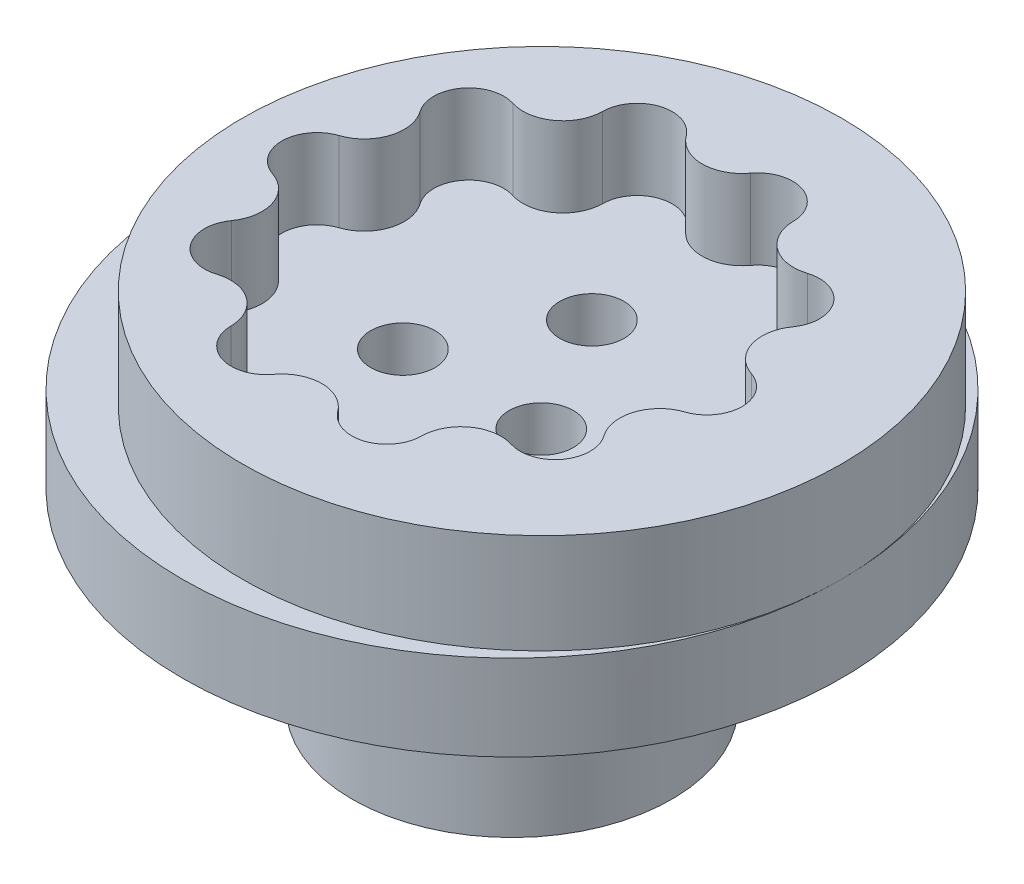
ISO-10303-21;
HEADER;
FILE_DESCRIPTION(('STEP AP214'),'2;1');
FILE_NAME('part.step','',(''),(''),'','','');
FILE_SCHEMA(('AUTOMOTIVE_DESIGN { 1 0 10303 214 1 1 1 1 }'));
ENDSEC;
DATA;
#1=APPLICATION_CONTEXT('core data for automotive mechanical design processes');
#2=APPLICATION_PROTOCOL_DEFINITION('international standard','automotive_design',2000,#1);
#3=PRODUCT_CONTEXT('',#1,'mechanical');
#4=PRODUCT('Part','Part','',(#3));
#5=PRODUCT_RELATED_PRODUCT_CATEGORY('part','',(#4));
#6=PRODUCT_DEFINITION_FORMATION('','',#4);
#7=PRODUCT_DEFINITION_CONTEXT('part definition',#1,'design');
#8=PRODUCT_DEFINITION('design','',#6,#7);
#9=PRODUCT_DEFINITION_SHAPE('','',#8);
#10=(LENGTH_UNIT() NAMED_UNIT(*) SI_UNIT(.MILLI.,.METRE.));
#11=(NAMED_UNIT(*) PLANE_ANGLE_UNIT() SI_UNIT($,.RADIAN.));
#12=(NAMED_UNIT(*) SI_UNIT($,.STERADIAN.) SOLID_ANGLE_UNIT());
#13=UNCERTAINTY_MEASURE_WITH_UNIT(LENGTH_MEASURE(1.E-05),#10,'distance_accuracy_value','');
#14=(GEOMETRIC_REPRESENTATION_CONTEXT(3) GLOBAL_UNCERTAINTY_ASSIGNED_CONTEXT((#13)) GLOBAL_UNIT_ASSIGNED_CONTEXT((#10,
#11,#12)) REPRESENTATION_CONTEXT('',''));
#15=CARTESIAN_POINT('',(0.,0.,0.));
#16=DIRECTION('',(0.,0.,1.));
#17=DIRECTION('',(1.,0.,0.));
#18=AXIS2_PLACEMENT_3D('',#15,#16,#17);
#19=CARTESIAN_POINT('',(0.,-8.397875,0.));
#20=DIRECTION('',(0.,1.,0.));
#21=DIRECTION('',(0.,0.,1.));
#22=AXIS2_PLACEMENT_3D('',#19,#20,#21);
#23=CYLINDRICAL_SURFACE('',#22,26.19375);
#24=CARTESIAN_POINT('',(0.,-8.397875,0.));
#25=DIRECTION('',(0.,1.,0.));
#26=DIRECTION('',(0.,0.,1.));
#27=AXIS2_PLACEMENT_3D('',#24,#25,#26);
#28=CIRCLE('',#27,26.19375);
#29=CARTESIAN_POINT('',(0.,-8.397875,26.19375));
#30=VERTEX_POINT('',#29);
#31=EDGE_CURVE('E334',#30,#30,#28,.T.);
#32=ORIENTED_EDGE('',*,*,#31,.T.);
#33=EDGE_LOOP('',(#32));
#34=FACE_BOUND('',#33,.T.);
#35=CARTESIAN_POINT('',(0.,-1.5875,0.));
#36=DIRECTION('',(0.,1.,0.));
#37=DIRECTION('',(0.,0.,1.));
#38=AXIS2_PLACEMENT_3D('',#35,#36,#37);
#39=CIRCLE('',#38,26.19375);
#40=CARTESIAN_POINT('',(26.19375,-1.5875,0.));
#41=VERTEX_POINT('',#40);
#42=EDGE_CURVE('E11',#41,#41,#39,.F.);
#43=ORIENTED_EDGE('',*,*,#42,.T.);
#44=EDGE_LOOP('',(#43));
#45=FACE_BOUND('',#44,.T.);
#46=ADVANCED_FACE('F37',(#34,#45),#23,.T.);
#47=CARTESIAN_POINT('',(0.,6.35,0.));
#48=DIRECTION('',(0.,1.,0.));
#49=DIRECTION('',(0.,0.,1.));
#50=AXIS2_PLACEMENT_3D('',#47,#48,#49);
#51=PLANE('',#50);
#52=CARTESIAN_POINT('',(-10.7494166939248,6.35,-14.795302793129));
#53=DIRECTION('',(0.,-1.,0.));
#54=DIRECTION('',(0.,0.,1.));
#55=AXIS2_PLACEMENT_3D('',#52,#53,#54);
#56=CIRCLE('',#55,3.175);
#57=CARTESIAN_POINT('',(-7.57452672067544,6.35,-14.7688706581247));
#58=VERTEX_POINT('',#57);
#59=CARTESIAN_POINT('',(-11.705373196694,6.35,-11.7676350166362));
#60=VERTEX_POINT('',#59);
#61=EDGE_CURVE('E201',#58,#60,#56,.T.);
#62=ORIENTED_EDGE('',*,*,#61,.F.);
#63=CARTESIAN_POINT('',(-4.79116776815351,6.35,-14.7456981638907));
#64=DIRECTION('',(0.,1.,0.));
#65=DIRECTION('',(0.,0.,-1.));
#66=AXIS2_PLACEMENT_3D('',#63,#64,#65);
#67=CIRCLE('',#66,2.78345541064933);
#68=CARTESIAN_POINT('',(-2.55300352448717,6.35,-16.4004624496567));
#69=VERTEX_POINT('',#68);
#70=EDGE_CURVE('E187',#69,#58,#67,.T.);
#71=ORIENTED_EDGE('',*,*,#70,.F.);
#72=CARTESIAN_POINT('',(0.,6.35,-18.288));
#73=DIRECTION('',(0.,-1.,0.));
#74=DIRECTION('',(0.,0.,-1.));
#75=AXIS2_PLACEMENT_3D('',#72,#73,#74);
#76=CIRCLE('',#75,3.175);
#77=CARTESIAN_POINT('',(2.55300352448717,6.35,-16.4004624496567));
#78=VERTEX_POINT('',#77);
#79=EDGE_CURVE('E176',#78,#69,#76,.T.);
#80=ORIENTED_EDGE('',*,*,#79,.F.);
#81=CARTESIAN_POINT('',(4.79116776815351,6.35,-14.7456981638907));
#82=DIRECTION('',(0.,1.,0.));
#83=DIRECTION('',(0.,0.,-1.));
#84=AXIS2_PLACEMENT_3D('',#81,#82,#83);
#85=CIRCLE('',#84,2.78345541064932);
#86=CARTESIAN_POINT('',(7.57452672067544,6.35,-14.7688706581247));
#87=VERTEX_POINT('',#86);
#88=EDGE_CURVE('E238',#87,#78,#85,.T.);
#89=ORIENTED_EDGE('',*,*,#88,.F.);
#90=CARTESIAN_POINT('',(10.7494166939248,6.35,-14.795302793129));
#91=DIRECTION('',(0.,-1.,0.));
#92=DIRECTION('',(0.,0.,1.));
#93=AXIS2_PLACEMENT_3D('',#90,#91,#92);
#94=CIRCLE('',#93,3.175);
#95=CARTESIAN_POINT('',(11.7053731966939,6.35,-11.7676350166362));
#96=VERTEX_POINT('',#95);
#97=EDGE_CURVE('E236',#96,#87,#94,.T.);
#98=ORIENTED_EDGE('',*,*,#97,.F.);
#99=CARTESIAN_POINT('',(12.5434400628289,6.35,-9.11334265313137));
#100=DIRECTION('',(0.,1.,0.));
#101=DIRECTION('',(0.,0.,-1.));
#102=AXIS2_PLACEMENT_3D('',#99,#100,#101);
#103=CIRCLE('',#102,2.78345541064933);
#104=CARTESIAN_POINT('',(14.8088452072343,6.35,-7.49607225064008));
#105=VERTEX_POINT('',#104);
#106=EDGE_CURVE('E234',#105,#96,#103,.T.);
#107=ORIENTED_EDGE('',*,*,#106,.F.);
#108=CARTESIAN_POINT('',(17.3929215700058,6.35,-5.65130279312901));
#109=DIRECTION('',(0.,-1.,0.));
#110=DIRECTION('',(0.,0.,1.));
#111=AXIS2_PLACEMENT_3D('',#108,#109,#110);
#112=CIRCLE('',#111,3.175);
#113=CARTESIAN_POINT('',(16.3866881587656,6.35,-2.63997097446405));
#114=VERTEX_POINT('',#113);
#115=EDGE_CURVE('E232',#114,#105,#112,.T.);
#116=ORIENTED_EDGE('',*,*,#115,.F.);
#117=CARTESIAN_POINT('',(15.5045445893507,6.35,0.));
#118=DIRECTION('',(0.,1.,0.));
#119=DIRECTION('',(0.,0.,-1.));
#120=AXIS2_PLACEMENT_3D('',#117,#118,#119);
#121=CIRCLE('',#120,2.78345541064933);
#122=CARTESIAN_POINT('',(16.3866881587657,6.35,2.63997097446412));
#123=VERTEX_POINT('',#122);
#124=EDGE_CURVE('E230',#123,#114,#121,.T.);
#125=ORIENTED_EDGE('',*,*,#124,.F.);
#126=CARTESIAN_POINT('',(17.3929215700058,6.35,5.65130279312908));
#127=DIRECTION('',(0.,-1.,0.));
#128=DIRECTION('',(0.,0.,1.));
#129=AXIS2_PLACEMENT_3D('',#126,#127,#128);
#130=CIRCLE('',#129,3.175);
#131=CARTESIAN_POINT('',(14.8088452072343,6.35,7.49607225064015));
#132=VERTEX_POINT('',#131);
#133=EDGE_CURVE('E228',#132,#123,#130,.T.);
#134=ORIENTED_EDGE('',*,*,#133,.F.);
#135=CARTESIAN_POINT('',(12.5434400628288,6.35,9.11334265313143));
#136=DIRECTION('',(0.,1.,0.));
#137=DIRECTION('',(0.,0.,-1.));
#138=AXIS2_PLACEMENT_3D('',#135,#136,#137);
#139=CIRCLE('',#138,2.78345541064933);
#140=CARTESIAN_POINT('',(11.7053731966939,6.35,11.7676350166362));
#141=VERTEX_POINT('',#140);
#142=EDGE_CURVE('E226',#141,#132,#139,.T.);
#143=ORIENTED_EDGE('',*,*,#142,.F.);
#144=CARTESIAN_POINT('',(10.7494166939248,6.35,14.7953027931291));
#145=DIRECTION('',(0.,-1.,0.));
#146=DIRECTION('',(0.,0.,1.));
#147=AXIS2_PLACEMENT_3D('',#144,#145,#146);
#148=CIRCLE('',#147,3.175);
#149=CARTESIAN_POINT('',(7.57452672067542,6.35,14.7688706581247));
#150=VERTEX_POINT('',#149);
#151=EDGE_CURVE('E224',#150,#141,#148,.T.);
#152=ORIENTED_EDGE('',*,*,#151,.F.);
#153=CARTESIAN_POINT('',(4.79116776815349,6.35,14.7456981638908));
#154=DIRECTION('',(0.,1.,0.));
#155=DIRECTION('',(0.,0.,-1.));
#156=AXIS2_PLACEMENT_3D('',#153,#154,#155);
#157=CIRCLE('',#156,2.78345541064933);
#158=CARTESIAN_POINT('',(2.55300352448715,6.35,16.4004624496567));
#159=VERTEX_POINT('',#158);
#160=EDGE_CURVE('E222',#159,#150,#157,.T.);
#161=ORIENTED_EDGE('',*,*,#160,.F.);
#162=CARTESIAN_POINT('',(0.,6.35,18.288));
#163=DIRECTION('',(0.,-1.,0.));
#164=DIRECTION('',(0.,0.,1.));
#165=AXIS2_PLACEMENT_3D('',#162,#163,#164);
#166=CIRCLE('',#165,3.175);
#167=CARTESIAN_POINT('',(-2.55300352448719,6.35,16.4004624496567));
#168=VERTEX_POINT('',#167);
#169=EDGE_CURVE('E220',#168,#159,#166,.T.);
#170=ORIENTED_EDGE('',*,*,#169,.F.);
#171=CARTESIAN_POINT('',(-4.79116776815352,6.35,14.7456981638908));
#172=DIRECTION('',(0.,1.,0.));
#173=DIRECTION('',(0.,0.,-1.));
#174=AXIS2_PLACEMENT_3D('',#171,#172,#173);
#175=CIRCLE('',#174,2.78345541064933);
#176=CARTESIAN_POINT('',(-7.57452672067546,6.35,14.7688706581247));
#177=VERTEX_POINT('',#176);
#178=EDGE_CURVE('E218',#177,#168,#175,.T.);
#179=ORIENTED_EDGE('',*,*,#178,.F.);
#180=CARTESIAN_POINT('',(-10.7494166939248,6.35,14.7953027931291));
#181=DIRECTION('',(0.,-1.,0.));
#182=DIRECTION('',(0.,0.,1.));
#183=AXIS2_PLACEMENT_3D('',#180,#181,#182);
#184=CIRCLE('',#183,3.175);
#185=CARTESIAN_POINT('',(-11.705373196694,6.35,11.7676350166362));
#186=VERTEX_POINT('',#185);
#187=EDGE_CURVE('E216',#186,#177,#184,.T.);
#188=ORIENTED_EDGE('',*,*,#187,.F.);
#189=CARTESIAN_POINT('',(-12.5434400628289,6.35,9.11334265313142));
#190=DIRECTION('',(0.,1.,0.));
#191=DIRECTION('',(0.,0.,-1.));
#192=AXIS2_PLACEMENT_3D('',#189,#190,#191);
#193=CIRCLE('',#192,2.78345541064933);
#194=CARTESIAN_POINT('',(-14.8088452072343,6.35,7.49607225064014));
#195=VERTEX_POINT('',#194);
#196=EDGE_CURVE('E214',#195,#186,#193,.T.);
#197=ORIENTED_EDGE('',*,*,#196,.F.);
#198=CARTESIAN_POINT('',(-17.3929215700058,6.35,5.65130279312907));
#199=DIRECTION('',(0.,-1.,0.));
#200=DIRECTION('',(0.,0.,1.));
#201=AXIS2_PLACEMENT_3D('',#198,#199,#200);
#202=CIRCLE('',#201,3.175);
#203=CARTESIAN_POINT('',(-16.3866881587657,6.35,2.6399709744641));
#204=VERTEX_POINT('',#203);
#205=EDGE_CURVE('E212',#204,#195,#202,.T.);
#206=ORIENTED_EDGE('',*,*,#205,.F.);
#207=CARTESIAN_POINT('',(-15.5045445893507,6.35,0.));
#208=DIRECTION('',(0.,1.,0.));
#209=DIRECTION('',(0.,0.,-1.));
#210=AXIS2_PLACEMENT_3D('',#207,#208,#209);
#211=CIRCLE('',#210,2.78345541064933);
#212=CARTESIAN_POINT('',(-16.3866881587657,6.35,-2.63997097446407));
#213=VERTEX_POINT('',#212);
#214=EDGE_CURVE('E210',#213,#204,#211,.T.);
#215=ORIENTED_EDGE('',*,*,#214,.F.);
#216=CARTESIAN_POINT('',(-17.3929215700058,6.35,-5.65130279312902));
#217=DIRECTION('',(0.,-1.,0.));
#218=DIRECTION('',(0.,0.,1.));
#219=AXIS2_PLACEMENT_3D('',#216,#217,#218);
#220=CIRCLE('',#219,3.175);
#221=CARTESIAN_POINT('',(-14.8088452072343,6.35,-7.4960722506401));
#222=VERTEX_POINT('',#221);
#223=EDGE_CURVE('E208',#222,#213,#220,.T.);
#224=ORIENTED_EDGE('',*,*,#223,.F.);
#225=CARTESIAN_POINT('',(-12.5434400628289,6.35,-9.11334265313138));
#226=DIRECTION('',(0.,1.,0.));
#227=DIRECTION('',(0.,0.,-1.));
#228=AXIS2_PLACEMENT_3D('',#225,#226,#227);
#229=CIRCLE('',#228,2.78345541064933);
#230=EDGE_CURVE('E203',#60,#222,#229,.T.);
#231=ORIENTED_EDGE('',*,*,#230,.F.);
#232=EDGE_LOOP('',(#62,#71,#80,#89,#98,#107,#116,#125,#134,#143,#152,#161,#170,#179,#188,#197,
#206,#215,#224,#231));
#233=FACE_BOUND('',#232,.T.);
#234=CARTESIAN_POINT('',(2.38125,6.35,0.));
#235=DIRECTION('',(0.,1.,0.));
#236=DIRECTION('',(0.,0.,-1.));
#237=AXIS2_PLACEMENT_3D('',#234,#235,#236);
#238=CIRCLE('',#237,23.8125);
#239=CARTESIAN_POINT('',(2.38125,6.35,-23.8125));
#240=VERTEX_POINT('',#239);
#241=EDGE_CURVE('E356',#240,#240,#238,.T.);
#242=ORIENTED_EDGE('',*,*,#241,.T.);
#243=EDGE_LOOP('',(#242));
#244=FACE_BOUND('',#243,.T.);
#245=ADVANCED_FACE('F198',(#233,#244),#51,.T.);
#246=CARTESIAN_POINT('',(0.,-8.397875,0.));
#247=DIRECTION('',(0.,1.,0.));
#248=DIRECTION('',(0.,0.,1.));
#249=AXIS2_PLACEMENT_3D('',#246,#247,#248);
#250=PLANE('',#249);
#251=ORIENTED_EDGE('',*,*,#31,.F.);
#252=EDGE_LOOP('',(#251));
#253=FACE_BOUND('',#252,.T.);
#254=CARTESIAN_POINT('',(0.,-8.397875,0.));
#255=DIRECTION('',(0.,1.,0.));
#256=DIRECTION('',(0.,0.,1.));
#257=AXIS2_PLACEMENT_3D('',#254,#255,#256);
#258=CIRCLE('',#257,12.7);
#259=CARTESIAN_POINT('',(0.,-8.397875,12.7));
#260=VERTEX_POINT('',#259);
#261=EDGE_CURVE('E44',#260,#260,#258,.F.);
#262=ORIENTED_EDGE('',*,*,#261,.F.);
#263=EDGE_LOOP('',(#262));
#264=FACE_BOUND('',#263,.T.);
#265=ADVANCED_FACE('F374',(#253,#264),#250,.F.);
#266=CARTESIAN_POINT('',(0.,-23.479125,0.));
#267=DIRECTION('',(0.,1.,0.));
#268=DIRECTION('',(0.,0.,1.));
#269=AXIS2_PLACEMENT_3D('',#266,#267,#268);
#270=CYLINDRICAL_SURFACE('',#269,12.7);
#271=CARTESIAN_POINT('',(0.,-23.479125,0.));
#272=DIRECTION('',(0.,-1.,0.));
#273=DIRECTION('',(0.,0.,-1.));
#274=AXIS2_PLACEMENT_3D('',#271,#272,#273);
#275=CIRCLE('',#274,12.7);
#276=CARTESIAN_POINT('',(0.,-23.479125,12.7));
#277=VERTEX_POINT('',#276);
#278=EDGE_CURVE('E194',#277,#277,#275,.T.);
#279=CARTESIAN_POINT('',(0.,-23.479125,12.7));
#280=CARTESIAN_POINT('',(0.,-23.3220286458333,12.7));
#281=CARTESIAN_POINT('',(0.,-23.1649322916667,12.7));
#282=CARTESIAN_POINT('',(0.,-22.8507395833333,12.7));
#283=CARTESIAN_POINT('',(0.,-22.6936432291667,12.7));
#284=CARTESIAN_POINT('',(0.,-22.3794505208333,12.7));
#285=CARTESIAN_POINT('',(0.,-22.2223541666667,12.7));
#286=CARTESIAN_POINT('',(0.,-21.9081614583333,12.7));
#287=CARTESIAN_POINT('',(0.,-21.7510651041667,12.7));
#288=CARTESIAN_POINT('',(0.,-21.4368723958333,12.7));
#289=CARTESIAN_POINT('',(0.,-21.2797760416667,12.7));
#290=CARTESIAN_POINT('',(0.,-20.9655833333333,12.7));
#291=CARTESIAN_POINT('',(0.,-20.8084869791667,12.7));
#292=CARTESIAN_POINT('',(0.,-20.4942942708333,12.7));
#293=CARTESIAN_POINT('',(0.,-20.3371979166667,12.7));
#294=CARTESIAN_POINT('',(0.,-20.0230052083333,12.7));
#295=CARTESIAN_POINT('',(0.,-19.8659088541667,12.7));
#296=CARTESIAN_POINT('',(0.,-19.5517161458333,12.7));
#297=CARTESIAN_POINT('',(0.,-19.3946197916667,12.7));
#298=CARTESIAN_POINT('',(0.,-19.0804270833333,12.7));
#299=CARTESIAN_POINT('',(0.,-18.9233307291667,12.7));
#300=CARTESIAN_POINT('',(0.,-18.6091380208333,12.7));
#301=CARTESIAN_POINT('',(0.,-18.4520416666667,12.7));
#302=CARTESIAN_POINT('',(0.,-18.1378489583333,12.7));
#303=CARTESIAN_POINT('',(0.,-17.9807526041667,12.7));
#304=CARTESIAN_POINT('',(0.,-17.6665598958333,12.7));
#305=CARTESIAN_POINT('',(0.,-17.5094635416667,12.7));
#306=CARTESIAN_POINT('',(0.,-17.1952708333333,12.7));
#307=CARTESIAN_POINT('',(0.,-17.0381744791667,12.7));
#308=CARTESIAN_POINT('',(0.,-16.7239817708333,12.7));
#309=CARTESIAN_POINT('',(0.,-16.5668854166667,12.7));
#310=CARTESIAN_POINT('',(0.,-16.2526927083333,12.7));
#311=CARTESIAN_POINT('',(0.,-16.0955963541667,12.7));
#312=CARTESIAN_POINT('',(0.,-15.7814036458333,12.7));
#313=CARTESIAN_POINT('',(0.,-15.6243072916667,12.7));
#314=CARTESIAN_POINT('',(0.,-15.3101145833333,12.7));
#315=CARTESIAN_POINT('',(0.,-15.1530182291667,12.7));
#316=CARTESIAN_POINT('',(0.,-14.8388255208333,12.7));
#317=CARTESIAN_POINT('',(0.,-14.6817291666667,12.7));
#318=CARTESIAN_POINT('',(0.,-14.3675364583333,12.7));
#319=CARTESIAN_POINT('',(0.,-14.2104401041667,12.7));
#320=CARTESIAN_POINT('',(0.,-13.8962473958333,12.7));
#321=CARTESIAN_POINT('',(0.,-13.7391510416667,12.7));
#322=CARTESIAN_POINT('',(0.,-13.4249583333333,12.7));
#323=CARTESIAN_POINT('',(0.,-13.2678619791667,12.7));
#324=CARTESIAN_POINT('',(0.,-12.9536692708333,12.7));
#325=CARTESIAN_POINT('',(0.,-12.7965729166667,12.7));
#326=CARTESIAN_POINT('',(0.,-12.4823802083333,12.7));
#327=CARTESIAN_POINT('',(0.,-12.3252838541667,12.7));
#328=CARTESIAN_POINT('',(0.,-12.0110911458333,12.7));
#329=CARTESIAN_POINT('',(0.,-11.8539947916667,12.7));
#330=CARTESIAN_POINT('',(0.,-11.5398020833333,12.7));
#331=CARTESIAN_POINT('',(0.,-11.3827057291667,12.7));
#332=CARTESIAN_POINT('',(0.,-11.0685130208333,12.7));
#333=CARTESIAN_POINT('',(0.,-10.9114166666667,12.7));
#334=CARTESIAN_POINT('',(0.,-10.5972239583333,12.7));
#335=CARTESIAN_POINT('',(0.,-10.4401276041667,12.7));
#336=CARTESIAN_POINT('',(0.,-10.1259348958333,12.7));
#337=CARTESIAN_POINT('',(0.,-9.96883854166667,12.7));
#338=CARTESIAN_POINT('',(0.,-9.65464583333333,12.7));
#339=CARTESIAN_POINT('',(0.,-9.49754947916667,12.7));
#340=CARTESIAN_POINT('',(0.,-9.18335677083333,12.7));
#341=CARTESIAN_POINT('',(0.,-9.02626041666667,12.7));
#342=CARTESIAN_POINT('',(0.,-8.71206770833333,12.7));
#343=CARTESIAN_POINT('',(0.,-8.55497135416667,12.7));
#344=CARTESIAN_POINT('',(0.,-8.397875,12.7));
#345=B_SPLINE_CURVE_WITH_KNOTS('',3,(#279,#280,#281,#282,#283,#284,#285,#286,#287,#288,#289,
#290,#291,#292,#293,#294,#295,#296,#297,#298,#299,#300,#301,#302,#303,#304,#305,#306,#307,#308,
#309,#310,#311,#312,#313,#314,#315,#316,#317,#318,#319,#320,#321,#322,#323,#324,#325,#326,#327,
#328,#329,#330,#331,#332,#333,#334,#335,#336,#337,#338,#339,#340,#341,#342,#343,#344),
.UNSPECIFIED.,.F.,.F.,(4,2,2,2,2,2,2,2,2,2,2,2,2,2,2,2,2,2,2,2,2,2,2,2,2,2,2,2,2,2,2,2,4),(0.,
0.471289062499998,0.942578124999999,1.4138671875,1.88515625,2.3564453125,2.827734375,
3.2990234375,3.7703125,4.2416015625,4.712890625,5.1841796875,5.65546875,6.12675781249999,
6.598046875,7.06933593749999,7.540625,8.0119140625,8.48320312499999,8.95449218749999,
9.42578124999999,9.89707031249999,10.368359375,10.8396484375,11.3109375,11.7822265625,
12.253515625,12.7248046875,13.19609375,13.6673828125,14.138671875,14.6099609375,15.08125),.UNSPECIFIED.);
#346=EDGE_CURVE('BSEAM367',#277,#260,#345,.T.);
#347=ORIENTED_EDGE('',*,*,#278,.F.);
#348=ORIENTED_EDGE('',*,*,#261,.T.);
#349=ORIENTED_EDGE('',*,*,#346,.T.);
#350=ORIENTED_EDGE('',*,*,#346,.F.);
#351=EDGE_LOOP('',(#347,#349,#348,#350));
#352=FACE_BOUND('',#351,.T.);
#353=ADVANCED_FACE('F367',(#352),#270,.T.);
#354=CARTESIAN_POINT('',(0.,-23.479125,0.));
#355=DIRECTION('',(0.,-1.,0.));
#356=DIRECTION('',(0.,0.,-1.));
#357=AXIS2_PLACEMENT_3D('',#354,#355,#356);
#358=PLANE('',#357);
#359=CARTESIAN_POINT('',(0.,-23.479125,-6.35));
#360=DIRECTION('',(0.,-1.,0.));
#361=DIRECTION('',(0.,0.,-1.));
#362=AXIS2_PLACEMENT_3D('',#359,#360,#361);
#363=CIRCLE('',#362,2.55269999999999);
#364=CARTESIAN_POINT('',(0.,-23.479125,-8.90269999999999));
#365=VERTEX_POINT('',#364);
#366=EDGE_CURVE('E347',#365,#365,#363,.T.);
#367=ORIENTED_EDGE('',*,*,#366,.F.);
#368=EDGE_LOOP('',(#367));
#369=FACE_BOUND('',#368,.T.);
#370=CARTESIAN_POINT('',(-5.49926131403113,-23.479125,3.1750000000001));
#371=DIRECTION('',(0.,-1.,0.));
#372=DIRECTION('',(0.,0.,-1.));
#373=AXIS2_PLACEMENT_3D('',#370,#371,#372);
#374=CIRCLE('',#373,2.55269999999999);
#375=CARTESIAN_POINT('',(-5.49926131403113,-23.479125,0.622300000000115));
#376=VERTEX_POINT('',#375);
#377=EDGE_CURVE('E344',#376,#376,#374,.T.);
#378=ORIENTED_EDGE('',*,*,#377,.F.);
#379=EDGE_LOOP('',(#378));
#380=FACE_BOUND('',#379,.T.);
#381=CARTESIAN_POINT('',(5.49926131403126,-23.479125,3.17499999999987));
#382=DIRECTION('',(0.,-1.,0.));
#383=DIRECTION('',(0.,0.,-1.));
#384=AXIS2_PLACEMENT_3D('',#381,#382,#383);
#385=CIRCLE('',#384,2.55269999999999);
#386=CARTESIAN_POINT('',(5.49926131403126,-23.479125,0.622299999999885));
#387=VERTEX_POINT('',#386);
#388=EDGE_CURVE('E341',#387,#387,#385,.T.);
#389=ORIENTED_EDGE('',*,*,#388,.F.);
#390=EDGE_LOOP('',(#389));
#391=FACE_BOUND('',#390,.T.);
#392=ORIENTED_EDGE('',*,*,#278,.T.);
#393=EDGE_LOOP('',(#392));
#394=FACE_BOUND('',#393,.T.);
#395=ADVANCED_FACE('F364',(#369,#380,#391,#394),#358,.T.);
#396=CARTESIAN_POINT('',(-4.79116776815351,6.35,-14.7456981638907));
#397=DIRECTION('',(0.,-1.,0.));
#398=DIRECTION('',(0.,0.,-1.));
#399=AXIS2_PLACEMENT_3D('',#396,#397,#398);
#400=CYLINDRICAL_SURFACE('',#399,2.78345541064933);
#401=CARTESIAN_POINT('',(-4.79116776815351,0.,-14.7456981638907));
#402=DIRECTION('',(0.,1.,0.));
#403=DIRECTION('',(0.,0.,-1.));
#404=AXIS2_PLACEMENT_3D('',#401,#402,#403);
#405=CIRCLE('',#404,2.78345541064933);
#406=CARTESIAN_POINT('',(-2.55300352448718,0.,-16.4004624496567));
#407=VERTEX_POINT('',#406);
#408=CARTESIAN_POINT('',(-7.57452672067543,0.,-14.7688706581247));
#409=VERTEX_POINT('',#408);
#410=EDGE_CURVE('E57',#407,#409,#405,.T.);
#411=ORIENTED_EDGE('',*,*,#410,.F.);
#412=DIRECTION('',(0.,-1.,0.));
#413=VECTOR('',#412,1.);
#414=CARTESIAN_POINT('',(-2.55300352448717,6.35,-16.4004624496567));
#415=LINE('',#414,#413);
#416=EDGE_CURVE('E180',#69,#407,#415,.T.);
#417=ORIENTED_EDGE('',*,*,#416,.F.);
#418=ORIENTED_EDGE('',*,*,#70,.T.);
#419=DIRECTION('',(0.,-1.,0.));
#420=VECTOR('',#419,1.);
#421=CARTESIAN_POINT('',(-7.57452672067544,6.35,-14.7688706581247));
#422=LINE('',#421,#420);
#423=EDGE_CURVE('E195',#58,#409,#422,.T.);
#424=ORIENTED_EDGE('',*,*,#423,.T.);
#425=EDGE_LOOP('',(#411,#417,#418,#424));
#426=FACE_BOUND('',#425,.T.);
#427=ADVANCED_FACE('F191',(#426),#400,.F.);
#428=CARTESIAN_POINT('',(-10.7494166939248,6.35,-14.795302793129));
#429=DIRECTION('',(0.,-1.,0.));
#430=DIRECTION('',(0.,0.,-1.));
#431=AXIS2_PLACEMENT_3D('',#428,#429,#430);
#432=CYLINDRICAL_SURFACE('',#431,3.175);
#433=CARTESIAN_POINT('',(-10.7494166939248,0.,-14.795302793129));
#434=DIRECTION('',(0.,-1.,0.));
#435=DIRECTION('',(0.,0.,-1.));
#436=AXIS2_PLACEMENT_3D('',#433,#434,#435);
#437=CIRCLE('',#436,3.175);
#438=CARTESIAN_POINT('',(-11.705373196694,0.,-11.7676350166362));
#439=VERTEX_POINT('',#438);
#440=EDGE_CURVE('E241',#409,#439,#437,.T.);
#441=ORIENTED_EDGE('',*,*,#440,.F.);
#442=ORIENTED_EDGE('',*,*,#423,.F.);
#443=ORIENTED_EDGE('',*,*,#61,.T.);
#444=DIRECTION('',(0.,-1.,0.));
#445=VECTOR('',#444,1.);
#446=CARTESIAN_POINT('',(-11.705373196694,6.35,-11.7676350166362));
#447=LINE('',#446,#445);
#448=EDGE_CURVE('E328',#60,#439,#447,.T.);
#449=ORIENTED_EDGE('',*,*,#448,.T.);
#450=EDGE_LOOP('',(#441,#442,#443,#449));
#451=FACE_BOUND('',#450,.T.);
#452=ADVANCED_FACE('F481',(#451),#432,.T.);
#453=CARTESIAN_POINT('',(-12.5434400628289,6.35,-9.11334265313138));
#454=DIRECTION('',(0.,-1.,0.));
#455=DIRECTION('',(0.,0.,-1.));
#456=AXIS2_PLACEMENT_3D('',#453,#454,#455);
#457=CYLINDRICAL_SURFACE('',#456,2.78345541064933);
#458=CARTESIAN_POINT('',(-12.5434400628289,0.,-9.11334265313138));
#459=DIRECTION('',(0.,1.,0.));
#460=DIRECTION('',(0.,0.,-1.));
#461=AXIS2_PLACEMENT_3D('',#458,#459,#460);
#462=CIRCLE('',#461,2.78345541064933);
#463=CARTESIAN_POINT('',(-14.8088452072343,0.,-7.4960722506401));
#464=VERTEX_POINT('',#463);
#465=EDGE_CURVE('E244',#439,#464,#462,.T.);
#466=ORIENTED_EDGE('',*,*,#465,.F.);
#467=ORIENTED_EDGE('',*,*,#448,.F.);
#468=ORIENTED_EDGE('',*,*,#230,.T.);
#469=DIRECTION('',(0.,-1.,0.));
#470=VECTOR('',#469,1.);
#471=CARTESIAN_POINT('',(-14.8088452072343,6.35,-7.4960722506401));
#472=LINE('',#471,#470);
#473=EDGE_CURVE('E325',#222,#464,#472,.T.);
#474=ORIENTED_EDGE('',*,*,#473,.T.);
#475=EDGE_LOOP('',(#466,#467,#468,#474));
#476=FACE_BOUND('',#475,.T.);
#477=ADVANCED_FACE('F477',(#476),#457,.F.);
#478=CARTESIAN_POINT('',(-17.3929215700058,6.35,-5.65130279312903));
#479=DIRECTION('',(0.,-1.,0.));
#480=DIRECTION('',(0.,0.,-1.));
#481=AXIS2_PLACEMENT_3D('',#478,#479,#480);
#482=CYLINDRICAL_SURFACE('',#481,3.175);
#483=CARTESIAN_POINT('',(-17.3929215700058,0.,-5.65130279312903));
#484=DIRECTION('',(0.,-1.,0.));
#485=DIRECTION('',(0.,0.,-1.));
#486=AXIS2_PLACEMENT_3D('',#483,#484,#485);
#487=CIRCLE('',#486,3.175);
#488=CARTESIAN_POINT('',(-16.3866881587657,0.,-2.63997097446407));
#489=VERTEX_POINT('',#488);
#490=EDGE_CURVE('E246',#464,#489,#487,.T.);
#491=ORIENTED_EDGE('',*,*,#490,.F.);
#492=ORIENTED_EDGE('',*,*,#473,.F.);
#493=ORIENTED_EDGE('',*,*,#223,.T.);
#494=DIRECTION('',(0.,-1.,0.));
#495=VECTOR('',#494,1.);
#496=CARTESIAN_POINT('',(-16.3866881587657,6.35,-2.63997097446407));
#497=LINE('',#496,#495);
#498=EDGE_CURVE('E322',#213,#489,#497,.T.);
#499=ORIENTED_EDGE('',*,*,#498,.T.);
#500=EDGE_LOOP('',(#491,#492,#493,#499));
#501=FACE_BOUND('',#500,.T.);
#502=ADVANCED_FACE('F473',(#501),#482,.T.);
#503=CARTESIAN_POINT('',(-15.5045445893507,6.35,0.));
#504=DIRECTION('',(0.,-1.,0.));
#505=DIRECTION('',(0.,0.,-1.));
#506=AXIS2_PLACEMENT_3D('',#503,#504,#505);
#507=CYLINDRICAL_SURFACE('',#506,2.78345541064933);
#508=CARTESIAN_POINT('',(-15.5045445893507,0.,0.));
#509=DIRECTION('',(0.,1.,0.));
#510=DIRECTION('',(0.,0.,-1.));
#511=AXIS2_PLACEMENT_3D('',#508,#509,#510);
#512=CIRCLE('',#511,2.78345541064933);
#513=CARTESIAN_POINT('',(-16.3866881587657,0.,2.6399709744641));
#514=VERTEX_POINT('',#513);
#515=EDGE_CURVE('E248',#489,#514,#512,.T.);
#516=ORIENTED_EDGE('',*,*,#515,.F.);
#517=ORIENTED_EDGE('',*,*,#498,.F.);
#518=ORIENTED_EDGE('',*,*,#214,.T.);
#519=DIRECTION('',(0.,-1.,0.));
#520=VECTOR('',#519,1.);
#521=CARTESIAN_POINT('',(-16.3866881587657,6.35,2.6399709744641));
#522=LINE('',#521,#520);
#523=EDGE_CURVE('E319',#204,#514,#522,.T.);
#524=ORIENTED_EDGE('',*,*,#523,.T.);
#525=EDGE_LOOP('',(#516,#517,#518,#524));
#526=FACE_BOUND('',#525,.T.);
#527=ADVANCED_FACE('F469',(#526),#507,.F.);
#528=CARTESIAN_POINT('',(-17.3929215700058,6.35,5.65130279312906));
#529=DIRECTION('',(0.,-1.,0.));
#530=DIRECTION('',(0.,0.,-1.));
#531=AXIS2_PLACEMENT_3D('',#528,#529,#530);
#532=CYLINDRICAL_SURFACE('',#531,3.175);
#533=CARTESIAN_POINT('',(-17.3929215700058,0.,5.65130279312906));
#534=DIRECTION('',(0.,-1.,0.));
#535=DIRECTION('',(0.,0.,-1.));
#536=AXIS2_PLACEMENT_3D('',#533,#534,#535);
#537=CIRCLE('',#536,3.175);
#538=CARTESIAN_POINT('',(-14.8088452072343,0.,7.49607225064014));
#539=VERTEX_POINT('',#538);
#540=EDGE_CURVE('E250',#514,#539,#537,.T.);
#541=ORIENTED_EDGE('',*,*,#540,.F.);
#542=ORIENTED_EDGE('',*,*,#523,.F.);
#543=ORIENTED_EDGE('',*,*,#205,.T.);
#544=DIRECTION('',(0.,-1.,0.));
#545=VECTOR('',#544,1.);
#546=CARTESIAN_POINT('',(-14.8088452072343,6.35,7.49607225064014));
#547=LINE('',#546,#545);
#548=EDGE_CURVE('E316',#195,#539,#547,.T.);
#549=ORIENTED_EDGE('',*,*,#548,.T.);
#550=EDGE_LOOP('',(#541,#542,#543,#549));
#551=FACE_BOUND('',#550,.T.);
#552=ADVANCED_FACE('F465',(#551),#532,.T.);
#553=CARTESIAN_POINT('',(-12.5434400628289,6.35,9.11334265313142));
#554=DIRECTION('',(0.,-1.,0.));
#555=DIRECTION('',(0.,0.,-1.));
#556=AXIS2_PLACEMENT_3D('',#553,#554,#555);
#557=CYLINDRICAL_SURFACE('',#556,2.78345541064933);
#558=CARTESIAN_POINT('',(-12.5434400628289,0.,9.11334265313142));
#559=DIRECTION('',(0.,1.,0.));
#560=DIRECTION('',(0.,0.,-1.));
#561=AXIS2_PLACEMENT_3D('',#558,#559,#560);
#562=CIRCLE('',#561,2.78345541064933);
#563=CARTESIAN_POINT('',(-11.705373196694,0.,11.7676350166362));
#564=VERTEX_POINT('',#563);
#565=EDGE_CURVE('E252',#539,#564,#562,.T.);
#566=ORIENTED_EDGE('',*,*,#565,.F.);
#567=ORIENTED_EDGE('',*,*,#548,.F.);
#568=ORIENTED_EDGE('',*,*,#196,.T.);
#569=DIRECTION('',(0.,-1.,0.));
#570=VECTOR('',#569,1.);
#571=CARTESIAN_POINT('',(-11.705373196694,6.35,11.7676350166362));
#572=LINE('',#571,#570);
#573=EDGE_CURVE('E313',#186,#564,#572,.T.);
#574=ORIENTED_EDGE('',*,*,#573,.T.);
#575=EDGE_LOOP('',(#566,#567,#568,#574));
#576=FACE_BOUND('',#575,.T.);
#577=ADVANCED_FACE('F461',(#576),#557,.F.);
#578=CARTESIAN_POINT('',(-10.7494166939248,6.35,14.7953027931291));
#579=DIRECTION('',(0.,-1.,0.));
#580=DIRECTION('',(0.,0.,-1.));
#581=AXIS2_PLACEMENT_3D('',#578,#579,#580);
#582=CYLINDRICAL_SURFACE('',#581,3.175);
#583=CARTESIAN_POINT('',(-10.7494166939248,0.,14.7953027931291));
#584=DIRECTION('',(0.,-1.,0.));
#585=DIRECTION('',(0.,0.,-1.));
#586=AXIS2_PLACEMENT_3D('',#583,#584,#585);
#587=CIRCLE('',#586,3.175);
#588=CARTESIAN_POINT('',(-7.57452672067546,0.,14.7688706581247));
#589=VERTEX_POINT('',#588);
#590=EDGE_CURVE('E254',#564,#589,#587,.T.);
#591=ORIENTED_EDGE('',*,*,#590,.F.);
#592=ORIENTED_EDGE('',*,*,#573,.F.);
#593=ORIENTED_EDGE('',*,*,#187,.T.);
#594=DIRECTION('',(0.,-1.,0.));
#595=VECTOR('',#594,1.);
#596=CARTESIAN_POINT('',(-7.57452672067546,6.35,14.7688706581247));
#597=LINE('',#596,#595);
#598=EDGE_CURVE('E310',#177,#589,#597,.T.);
#599=ORIENTED_EDGE('',*,*,#598,.T.);
#600=EDGE_LOOP('',(#591,#592,#593,#599));
#601=FACE_BOUND('',#600,.T.);
#602=ADVANCED_FACE('F457',(#601),#582,.T.);
#603=CARTESIAN_POINT('',(-4.79116776815352,6.35,14.7456981638908));
#604=DIRECTION('',(0.,-1.,0.));
#605=DIRECTION('',(0.,0.,-1.));
#606=AXIS2_PLACEMENT_3D('',#603,#604,#605);
#607=CYLINDRICAL_SURFACE('',#606,2.78345541064933);
#608=CARTESIAN_POINT('',(-4.79116776815352,0.,14.7456981638908));
#609=DIRECTION('',(0.,1.,0.));
#610=DIRECTION('',(0.,0.,-1.));
#611=AXIS2_PLACEMENT_3D('',#608,#609,#610);
#612=CIRCLE('',#611,2.78345541064933);
#613=CARTESIAN_POINT('',(-2.55300352448719,0.,16.4004624496567));
#614=VERTEX_POINT('',#613);
#615=EDGE_CURVE('E256',#589,#614,#612,.T.);
#616=ORIENTED_EDGE('',*,*,#615,.F.);
#617=ORIENTED_EDGE('',*,*,#598,.F.);
#618=ORIENTED_EDGE('',*,*,#178,.T.);
#619=DIRECTION('',(0.,-1.,0.));
#620=VECTOR('',#619,1.);
#621=CARTESIAN_POINT('',(-2.55300352448719,6.35,16.4004624496567));
#622=LINE('',#621,#620);
#623=EDGE_CURVE('E307',#168,#614,#622,.T.);
#624=ORIENTED_EDGE('',*,*,#623,.T.);
#625=EDGE_LOOP('',(#616,#617,#618,#624));
#626=FACE_BOUND('',#625,.T.);
#627=ADVANCED_FACE('F453',(#626),#607,.F.);
#628=CARTESIAN_POINT('',(0.,6.35,18.288));
#629=DIRECTION('',(0.,-1.,0.));
#630=DIRECTION('',(0.,0.,-1.));
#631=AXIS2_PLACEMENT_3D('',#628,#629,#630);
#632=CYLINDRICAL_SURFACE('',#631,3.175);
#633=CARTESIAN_POINT('',(0.,0.,18.288));
#634=DIRECTION('',(0.,-1.,0.));
#635=DIRECTION('',(0.,0.,-1.));
#636=AXIS2_PLACEMENT_3D('',#633,#634,#635);
#637=CIRCLE('',#636,3.175);
#638=CARTESIAN_POINT('',(2.55300352448715,0.,16.4004624496567));
#639=VERTEX_POINT('',#638);
#640=EDGE_CURVE('E258',#614,#639,#637,.T.);
#641=ORIENTED_EDGE('',*,*,#640,.F.);
#642=ORIENTED_EDGE('',*,*,#623,.F.);
#643=ORIENTED_EDGE('',*,*,#169,.T.);
#644=DIRECTION('',(0.,-1.,0.));
#645=VECTOR('',#644,1.);
#646=CARTESIAN_POINT('',(2.55300352448715,6.35,16.4004624496567));
#647=LINE('',#646,#645);
#648=EDGE_CURVE('E304',#159,#639,#647,.T.);
#649=ORIENTED_EDGE('',*,*,#648,.T.);
#650=EDGE_LOOP('',(#641,#642,#643,#649));
#651=FACE_BOUND('',#650,.T.);
#652=ADVANCED_FACE('F449',(#651),#632,.T.);
#653=CARTESIAN_POINT('',(4.79116776815349,6.35,14.7456981638908));
#654=DIRECTION('',(0.,-1.,0.));
#655=DIRECTION('',(0.,0.,-1.));
#656=AXIS2_PLACEMENT_3D('',#653,#654,#655);
#657=CYLINDRICAL_SURFACE('',#656,2.78345541064933);
#658=CARTESIAN_POINT('',(4.79116776815349,0.,14.7456981638908));
#659=DIRECTION('',(0.,1.,0.));
#660=DIRECTION('',(0.,0.,-1.));
#661=AXIS2_PLACEMENT_3D('',#658,#659,#660);
#662=CIRCLE('',#661,2.78345541064933);
#663=CARTESIAN_POINT('',(7.57452672067541,0.,14.7688706581247));
#664=VERTEX_POINT('',#663);
#665=EDGE_CURVE('E260',#639,#664,#662,.T.);
#666=ORIENTED_EDGE('',*,*,#665,.F.);
#667=ORIENTED_EDGE('',*,*,#648,.F.);
#668=ORIENTED_EDGE('',*,*,#160,.T.);
#669=DIRECTION('',(0.,-1.,0.));
#670=VECTOR('',#669,1.);
#671=CARTESIAN_POINT('',(7.57452672067542,6.35,14.7688706581247));
#672=LINE('',#671,#670);
#673=EDGE_CURVE('E301',#150,#664,#672,.T.);
#674=ORIENTED_EDGE('',*,*,#673,.T.);
#675=EDGE_LOOP('',(#666,#667,#668,#674));
#676=FACE_BOUND('',#675,.T.);
#677=ADVANCED_FACE('F445',(#676),#657,.F.);
#678=CARTESIAN_POINT('',(10.7494166939247,6.35,14.7953027931291));
#679=DIRECTION('',(0.,-1.,0.));
#680=DIRECTION('',(0.,0.,-1.));
#681=AXIS2_PLACEMENT_3D('',#678,#679,#680);
#682=CYLINDRICAL_SURFACE('',#681,3.175);
#683=CARTESIAN_POINT('',(10.7494166939247,0.,14.7953027931291));
#684=DIRECTION('',(0.,-1.,0.));
#685=DIRECTION('',(0.,0.,-1.));
#686=AXIS2_PLACEMENT_3D('',#683,#684,#685);
#687=CIRCLE('',#686,3.175);
#688=CARTESIAN_POINT('',(11.7053731966939,0.,11.7676350166362));
#689=VERTEX_POINT('',#688);
#690=EDGE_CURVE('E262',#664,#689,#687,.T.);
#691=ORIENTED_EDGE('',*,*,#690,.F.);
#692=ORIENTED_EDGE('',*,*,#673,.F.);
#693=ORIENTED_EDGE('',*,*,#151,.T.);
#694=DIRECTION('',(0.,-1.,0.));
#695=VECTOR('',#694,1.);
#696=CARTESIAN_POINT('',(11.7053731966939,6.35,11.7676350166362));
#697=LINE('',#696,#695);
#698=EDGE_CURVE('E298',#141,#689,#697,.T.);
#699=ORIENTED_EDGE('',*,*,#698,.T.);
#700=EDGE_LOOP('',(#691,#692,#693,#699));
#701=FACE_BOUND('',#700,.T.);
#702=ADVANCED_FACE('F441',(#701),#682,.T.);
#703=CARTESIAN_POINT('',(12.5434400628288,6.35,9.11334265313143));
#704=DIRECTION('',(0.,-1.,0.));
#705=DIRECTION('',(0.,0.,-1.));
#706=AXIS2_PLACEMENT_3D('',#703,#704,#705);
#707=CYLINDRICAL_SURFACE('',#706,2.78345541064933);
#708=CARTESIAN_POINT('',(12.5434400628288,0.,9.11334265313143));
#709=DIRECTION('',(0.,1.,0.));
#710=DIRECTION('',(0.,0.,-1.));
#711=AXIS2_PLACEMENT_3D('',#708,#709,#710);
#712=CIRCLE('',#711,2.78345541064933);
#713=CARTESIAN_POINT('',(14.8088452072343,0.,7.49607225064015));
#714=VERTEX_POINT('',#713);
#715=EDGE_CURVE('E264',#689,#714,#712,.T.);
#716=ORIENTED_EDGE('',*,*,#715,.F.);
#717=ORIENTED_EDGE('',*,*,#698,.F.);
#718=ORIENTED_EDGE('',*,*,#142,.T.);
#719=DIRECTION('',(0.,-1.,0.));
#720=VECTOR('',#719,1.);
#721=CARTESIAN_POINT('',(14.8088452072343,6.35,7.49607225064015));
#722=LINE('',#721,#720);
#723=EDGE_CURVE('E295',#132,#714,#722,.T.);
#724=ORIENTED_EDGE('',*,*,#723,.T.);
#725=EDGE_LOOP('',(#716,#717,#718,#724));
#726=FACE_BOUND('',#725,.T.);
#727=ADVANCED_FACE('F437',(#726),#707,.F.);
#728=CARTESIAN_POINT('',(17.3929215700058,6.35,5.65130279312909));
#729=DIRECTION('',(0.,-1.,0.));
#730=DIRECTION('',(0.,0.,-1.));
#731=AXIS2_PLACEMENT_3D('',#728,#729,#730);
#732=CYLINDRICAL_SURFACE('',#731,3.175);
#733=CARTESIAN_POINT('',(17.3929215700058,0.,5.65130279312909));
#734=DIRECTION('',(0.,-1.,0.));
#735=DIRECTION('',(0.,0.,-1.));
#736=AXIS2_PLACEMENT_3D('',#733,#734,#735);
#737=CIRCLE('',#736,3.175);
#738=CARTESIAN_POINT('',(16.3866881587657,0.,2.63997097446412));
#739=VERTEX_POINT('',#738);
#740=EDGE_CURVE('E266',#714,#739,#737,.T.);
#741=ORIENTED_EDGE('',*,*,#740,.F.);
#742=ORIENTED_EDGE('',*,*,#723,.F.);
#743=ORIENTED_EDGE('',*,*,#133,.T.);
#744=DIRECTION('',(0.,-1.,0.));
#745=VECTOR('',#744,1.);
#746=CARTESIAN_POINT('',(16.3866881587657,6.35,2.63997097446412));
#747=LINE('',#746,#745);
#748=EDGE_CURVE('E292',#123,#739,#747,.T.);
#749=ORIENTED_EDGE('',*,*,#748,.T.);
#750=EDGE_LOOP('',(#741,#742,#743,#749));
#751=FACE_BOUND('',#750,.T.);
#752=ADVANCED_FACE('F433',(#751),#732,.T.);
#753=CARTESIAN_POINT('',(15.5045445893507,6.35,0.));
#754=DIRECTION('',(0.,-1.,0.));
#755=DIRECTION('',(0.,0.,-1.));
#756=AXIS2_PLACEMENT_3D('',#753,#754,#755);
#757=CYLINDRICAL_SURFACE('',#756,2.78345541064933);
#758=CARTESIAN_POINT('',(15.5045445893507,0.,0.));
#759=DIRECTION('',(0.,1.,0.));
#760=DIRECTION('',(0.,0.,-1.));
#761=AXIS2_PLACEMENT_3D('',#758,#759,#760);
#762=CIRCLE('',#761,2.78345541064933);
#763=CARTESIAN_POINT('',(16.3866881587656,0.,-2.63997097446405));
#764=VERTEX_POINT('',#763);
#765=EDGE_CURVE('E268',#739,#764,#762,.T.);
#766=ORIENTED_EDGE('',*,*,#765,.F.);
#767=ORIENTED_EDGE('',*,*,#748,.F.);
#768=ORIENTED_EDGE('',*,*,#124,.T.);
#769=DIRECTION('',(0.,-1.,0.));
#770=VECTOR('',#769,1.);
#771=CARTESIAN_POINT('',(16.3866881587656,6.35,-2.63997097446405));
#772=LINE('',#771,#770);
#773=EDGE_CURVE('E289',#114,#764,#772,.T.);
#774=ORIENTED_EDGE('',*,*,#773,.T.);
#775=EDGE_LOOP('',(#766,#767,#768,#774));
#776=FACE_BOUND('',#775,.T.);
#777=ADVANCED_FACE('F429',(#776),#757,.F.);
#778=CARTESIAN_POINT('',(17.3929215700058,6.35,-5.65130279312901));
#779=DIRECTION('',(0.,-1.,0.));
#780=DIRECTION('',(0.,0.,-1.));
#781=AXIS2_PLACEMENT_3D('',#778,#779,#780);
#782=CYLINDRICAL_SURFACE('',#781,3.175);
#783=CARTESIAN_POINT('',(17.3929215700058,0.,-5.65130279312901));
#784=DIRECTION('',(0.,-1.,0.));
#785=DIRECTION('',(0.,0.,-1.));
#786=AXIS2_PLACEMENT_3D('',#783,#784,#785);
#787=CIRCLE('',#786,3.175);
#788=CARTESIAN_POINT('',(14.8088452072343,0.,-7.49607225064008));
#789=VERTEX_POINT('',#788);
#790=EDGE_CURVE('E270',#764,#789,#787,.T.);
#791=ORIENTED_EDGE('',*,*,#790,.F.);
#792=ORIENTED_EDGE('',*,*,#773,.F.);
#793=ORIENTED_EDGE('',*,*,#115,.T.);
#794=DIRECTION('',(0.,-1.,0.));
#795=VECTOR('',#794,1.);
#796=CARTESIAN_POINT('',(14.8088452072343,6.35,-7.49607225064008));
#797=LINE('',#796,#795);
#798=EDGE_CURVE('E286',#105,#789,#797,.T.);
#799=ORIENTED_EDGE('',*,*,#798,.T.);
#800=EDGE_LOOP('',(#791,#792,#793,#799));
#801=FACE_BOUND('',#800,.T.);
#802=ADVANCED_FACE('F425',(#801),#782,.T.);
#803=CARTESIAN_POINT('',(12.5434400628289,6.35,-9.11334265313137));
#804=DIRECTION('',(0.,-1.,0.));
#805=DIRECTION('',(0.,0.,-1.));
#806=AXIS2_PLACEMENT_3D('',#803,#804,#805);
#807=CYLINDRICAL_SURFACE('',#806,2.78345541064933);
#808=CARTESIAN_POINT('',(12.5434400628289,0.,-9.11334265313137));
#809=DIRECTION('',(0.,1.,0.));
#810=DIRECTION('',(0.,0.,-1.));
#811=AXIS2_PLACEMENT_3D('',#808,#809,#810);
#812=CIRCLE('',#811,2.78345541064933);
#813=CARTESIAN_POINT('',(11.705373196694,0.,-11.7676350166361));
#814=VERTEX_POINT('',#813);
#815=EDGE_CURVE('E272',#789,#814,#812,.T.);
#816=ORIENTED_EDGE('',*,*,#815,.F.);
#817=ORIENTED_EDGE('',*,*,#798,.F.);
#818=ORIENTED_EDGE('',*,*,#106,.T.);
#819=DIRECTION('',(0.,-1.,0.));
#820=VECTOR('',#819,1.);
#821=CARTESIAN_POINT('',(11.7053731966939,6.35,-11.7676350166362));
#822=LINE('',#821,#820);
#823=EDGE_CURVE('E283',#96,#814,#822,.T.);
#824=ORIENTED_EDGE('',*,*,#823,.T.);
#825=EDGE_LOOP('',(#816,#817,#818,#824));
#826=FACE_BOUND('',#825,.T.);
#827=ADVANCED_FACE('F421',(#826),#807,.F.);
#828=CARTESIAN_POINT('',(10.7494166939248,6.35,-14.795302793129));
#829=DIRECTION('',(0.,-1.,0.));
#830=DIRECTION('',(0.,0.,-1.));
#831=AXIS2_PLACEMENT_3D('',#828,#829,#830);
#832=CYLINDRICAL_SURFACE('',#831,3.175);
#833=CARTESIAN_POINT('',(10.7494166939248,0.,-14.795302793129));
#834=DIRECTION('',(0.,-1.,0.));
#835=DIRECTION('',(0.,0.,-1.));
#836=AXIS2_PLACEMENT_3D('',#833,#834,#835);
#837=CIRCLE('',#836,3.175);
#838=CARTESIAN_POINT('',(7.57452672067544,0.,-14.7688706581247));
#839=VERTEX_POINT('',#838);
#840=EDGE_CURVE('E274',#814,#839,#837,.T.);
#841=ORIENTED_EDGE('',*,*,#840,.F.);
#842=ORIENTED_EDGE('',*,*,#823,.F.);
#843=ORIENTED_EDGE('',*,*,#97,.T.);
#844=DIRECTION('',(0.,-1.,0.));
#845=VECTOR('',#844,1.);
#846=CARTESIAN_POINT('',(7.57452672067544,6.35,-14.7688706581247));
#847=LINE('',#846,#845);
#848=EDGE_CURVE('E280',#87,#839,#847,.T.);
#849=ORIENTED_EDGE('',*,*,#848,.T.);
#850=EDGE_LOOP('',(#841,#842,#843,#849));
#851=FACE_BOUND('',#850,.T.);
#852=ADVANCED_FACE('F417',(#851),#832,.T.);
#853=CARTESIAN_POINT('',(4.79116776815351,6.35,-14.7456981638907));
#854=DIRECTION('',(0.,-1.,0.));
#855=DIRECTION('',(0.,0.,-1.));
#856=AXIS2_PLACEMENT_3D('',#853,#854,#855);
#857=CYLINDRICAL_SURFACE('',#856,2.78345541064932);
#858=CARTESIAN_POINT('',(4.79116776815351,0.,-14.7456981638907));
#859=DIRECTION('',(0.,1.,0.));
#860=DIRECTION('',(0.,0.,-1.));
#861=AXIS2_PLACEMENT_3D('',#858,#859,#860);
#862=CIRCLE('',#861,2.78345541064932);
#863=CARTESIAN_POINT('',(2.55300352448717,0.,-16.4004624496567));
#864=VERTEX_POINT('',#863);
#865=EDGE_CURVE('E276',#839,#864,#862,.T.);
#866=ORIENTED_EDGE('',*,*,#865,.F.);
#867=ORIENTED_EDGE('',*,*,#848,.F.);
#868=ORIENTED_EDGE('',*,*,#88,.T.);
#869=DIRECTION('',(0.,-1.,0.));
#870=VECTOR('',#869,1.);
#871=CARTESIAN_POINT('',(2.55300352448717,6.35,-16.4004624496567));
#872=LINE('',#871,#870);
#873=EDGE_CURVE('E182',#78,#864,#872,.T.);
#874=ORIENTED_EDGE('',*,*,#873,.T.);
#875=EDGE_LOOP('',(#866,#867,#868,#874));
#876=FACE_BOUND('',#875,.T.);
#877=ADVANCED_FACE('F414',(#876),#857,.F.);
#878=CARTESIAN_POINT('',(0.,6.35,-18.288));
#879=DIRECTION('',(0.,-1.,0.));
#880=DIRECTION('',(0.,0.,-1.));
#881=AXIS2_PLACEMENT_3D('',#878,#879,#880);
#882=CYLINDRICAL_SURFACE('',#881,3.175);
#883=CARTESIAN_POINT('',(0.,0.,-18.288));
#884=DIRECTION('',(0.,-1.,0.));
#885=DIRECTION('',(0.,0.,1.));
#886=AXIS2_PLACEMENT_3D('',#883,#884,#885);
#887=CIRCLE('',#886,3.175);
#888=EDGE_CURVE('E188',#864,#407,#887,.T.);
#889=ORIENTED_EDGE('',*,*,#888,.F.);
#890=ORIENTED_EDGE('',*,*,#873,.F.);
#891=ORIENTED_EDGE('',*,*,#79,.T.);
#892=ORIENTED_EDGE('',*,*,#416,.T.);
#893=EDGE_LOOP('',(#889,#890,#891,#892));
#894=FACE_BOUND('',#893,.T.);
#895=ADVANCED_FACE('F179',(#894),#882,.T.);
#896=CARTESIAN_POINT('',(0.,0.,0.));
#897=DIRECTION('',(0.,1.,0.));
#898=DIRECTION('',(0.,0.,1.));
#899=AXIS2_PLACEMENT_3D('',#896,#897,#898);
#900=PLANE('',#899);
#901=CARTESIAN_POINT('',(0.,0.,-6.35));
#902=DIRECTION('',(0.,1.,0.));
#903=DIRECTION('',(0.,0.,1.));
#904=AXIS2_PLACEMENT_3D('',#901,#902,#903);
#905=CIRCLE('',#904,2.55269999999999);
#906=CARTESIAN_POINT('',(0.,0.,-3.79730000000001));
#907=VERTEX_POINT('',#906);
#908=EDGE_CURVE('E345',#907,#907,#905,.T.);
#909=ORIENTED_EDGE('',*,*,#908,.F.);
#910=EDGE_LOOP('',(#909));
#911=FACE_BOUND('',#910,.T.);
#912=CARTESIAN_POINT('',(-5.49926131403113,0.,3.1750000000001));
#913=DIRECTION('',(0.,1.,0.));
#914=DIRECTION('',(0.,0.,1.));
#915=AXIS2_PLACEMENT_3D('',#912,#913,#914);
#916=CIRCLE('',#915,2.55269999999999);
#917=CARTESIAN_POINT('',(-5.49926131403113,0.,5.72770000000009));
#918=VERTEX_POINT('',#917);
#919=EDGE_CURVE('E342',#918,#918,#916,.T.);
#920=ORIENTED_EDGE('',*,*,#919,.F.);
#921=EDGE_LOOP('',(#920));
#922=FACE_BOUND('',#921,.T.);
#923=CARTESIAN_POINT('',(5.49926131403126,0.,3.17499999999987));
#924=DIRECTION('',(0.,1.,0.));
#925=DIRECTION('',(0.,0.,1.));
#926=AXIS2_PLACEMENT_3D('',#923,#924,#925);
#927=CIRCLE('',#926,2.55269999999999);
#928=CARTESIAN_POINT('',(5.49926131403126,0.,5.72769999999986));
#929=VERTEX_POINT('',#928);
#930=EDGE_CURVE('E242',#929,#929,#927,.T.);
#931=ORIENTED_EDGE('',*,*,#930,.F.);
#932=EDGE_LOOP('',(#931));
#933=FACE_BOUND('',#932,.T.);
#934=ORIENTED_EDGE('',*,*,#410,.T.);
#935=ORIENTED_EDGE('',*,*,#440,.T.);
#936=ORIENTED_EDGE('',*,*,#465,.T.);
#937=ORIENTED_EDGE('',*,*,#490,.T.);
#938=ORIENTED_EDGE('',*,*,#515,.T.);
#939=ORIENTED_EDGE('',*,*,#540,.T.);
#940=ORIENTED_EDGE('',*,*,#565,.T.);
#941=ORIENTED_EDGE('',*,*,#590,.T.);
#942=ORIENTED_EDGE('',*,*,#615,.T.);
#943=ORIENTED_EDGE('',*,*,#640,.T.);
#944=ORIENTED_EDGE('',*,*,#665,.T.);
#945=ORIENTED_EDGE('',*,*,#690,.T.);
#946=ORIENTED_EDGE('',*,*,#715,.T.);
#947=ORIENTED_EDGE('',*,*,#740,.T.);
#948=ORIENTED_EDGE('',*,*,#765,.T.);
#949=ORIENTED_EDGE('',*,*,#790,.T.);
#950=ORIENTED_EDGE('',*,*,#815,.T.);
#951=ORIENTED_EDGE('',*,*,#840,.T.);
#952=ORIENTED_EDGE('',*,*,#865,.T.);
#953=ORIENTED_EDGE('',*,*,#888,.T.);
#954=EDGE_LOOP('',(#934,#935,#936,#937,#938,#939,#940,#941,#942,#943,#944,#945,#946,#947,#948,
#949,#950,#951,#952,#953));
#955=FACE_BOUND('',#954,.T.);
#956=ADVANCED_FACE('F410',(#911,#922,#933,#955),#900,.T.);
#957=CARTESIAN_POINT('',(5.49926131403126,-23.479125,3.17499999999987));
#958=DIRECTION('',(0.,-1.,0.));
#959=DIRECTION('',(0.,0.,-1.));
#960=AXIS2_PLACEMENT_3D('',#957,#958,#959);
#961=CYLINDRICAL_SURFACE('',#960,2.55269999999999);
#962=ORIENTED_EDGE('',*,*,#930,.T.);
#963=EDGE_LOOP('',(#962));
#964=FACE_BOUND('',#963,.T.);
#965=ORIENTED_EDGE('',*,*,#388,.T.);
#966=EDGE_LOOP('',(#965));
#967=FACE_BOUND('',#966,.T.);
#968=ADVANCED_FACE('F362',(#964,#967),#961,.F.);
#969=CARTESIAN_POINT('',(-5.49926131403113,-23.479125,3.1750000000001));
#970=DIRECTION('',(0.,-1.,0.));
#971=DIRECTION('',(0.,0.,-1.));
#972=AXIS2_PLACEMENT_3D('',#969,#970,#971);
#973=CYLINDRICAL_SURFACE('',#972,2.55269999999999);
#974=ORIENTED_EDGE('',*,*,#919,.T.);
#975=EDGE_LOOP('',(#974));
#976=FACE_BOUND('',#975,.T.);
#977=ORIENTED_EDGE('',*,*,#377,.T.);
#978=EDGE_LOOP('',(#977));
#979=FACE_BOUND('',#978,.T.);
#980=ADVANCED_FACE('F402',(#976,#979),#973,.F.);
#981=CARTESIAN_POINT('',(0.,-23.479125,-6.35));
#982=DIRECTION('',(0.,-1.,0.));
#983=DIRECTION('',(0.,0.,-1.));
#984=AXIS2_PLACEMENT_3D('',#981,#982,#983);
#985=CYLINDRICAL_SURFACE('',#984,2.55269999999999);
#986=ORIENTED_EDGE('',*,*,#908,.T.);
#987=EDGE_LOOP('',(#986));
#988=FACE_BOUND('',#987,.T.);
#989=ORIENTED_EDGE('',*,*,#366,.T.);
#990=EDGE_LOOP('',(#989));
#991=FACE_BOUND('',#990,.T.);
#992=ADVANCED_FACE('F394',(#988,#991),#985,.F.);
#993=CARTESIAN_POINT('',(0.,-1.5875,0.));
#994=DIRECTION('',(0.,1.,0.));
#995=DIRECTION('',(0.,0.,1.));
#996=AXIS2_PLACEMENT_3D('',#993,#994,#995);
#997=PLANE('',#996);
#998=CARTESIAN_POINT('',(2.38125,-1.5875,0.));
#999=DIRECTION('',(0.,1.,0.));
#1000=DIRECTION('',(0.,0.,1.));
#1001=AXIS2_PLACEMENT_3D('',#998,#999,#1000);
#1002=CIRCLE('',#1001,23.8125);
#1003=EDGE_CURVE('E50',#41,#41,#1002,.T.);
#1004=ORIENTED_EDGE('',*,*,#1003,.F.);
#1005=ORIENTED_EDGE('',*,*,#42,.F.);
#1006=EDGE_LOOP('',(#1004,#1005));
#1007=FACE_BOUND('',#1006,.T.);
#1008=ADVANCED_FACE('F391',(#1007),#997,.T.);
#1009=CARTESIAN_POINT('',(2.38125,-1.5875,0.));
#1010=DIRECTION('',(0.,1.,0.));
#1011=DIRECTION('',(0.,0.,1.));
#1012=AXIS2_PLACEMENT_3D('',#1009,#1010,#1011);
#1013=CYLINDRICAL_SURFACE('',#1012,23.8125);
#1014=ORIENTED_EDGE('',*,*,#241,.F.);
#1015=EDGE_LOOP('',(#1014));
#1016=FACE_BOUND('',#1015,.T.);
#1017=ORIENTED_EDGE('',*,*,#1003,.T.);
#1018=EDGE_LOOP('',(#1017));
#1019=FACE_BOUND('',#1018,.T.);
#1020=ADVANCED_FACE('F393',(#1016,#1019),#1013,.T.);
#1021=CLOSED_SHELL('',(#46,#245,#265,#353,#395,#427,#452,#477,#502,#527,#552,#577,#602,#627,
#652,#677,#702,#727,#752,#777,#802,#827,#852,#877,#895,#956,#968,#980,#992,#1008,#1020));
#1022=MANIFOLD_SOLID_BREP('B2',#1021);
#1023=ADVANCED_BREP_SHAPE_REPRESENTATION('',(#18,#1022),#14);
#1024=SHAPE_DEFINITION_REPRESENTATION(#9,#1023);
ENDSEC;
END-ISO-10303-21;
